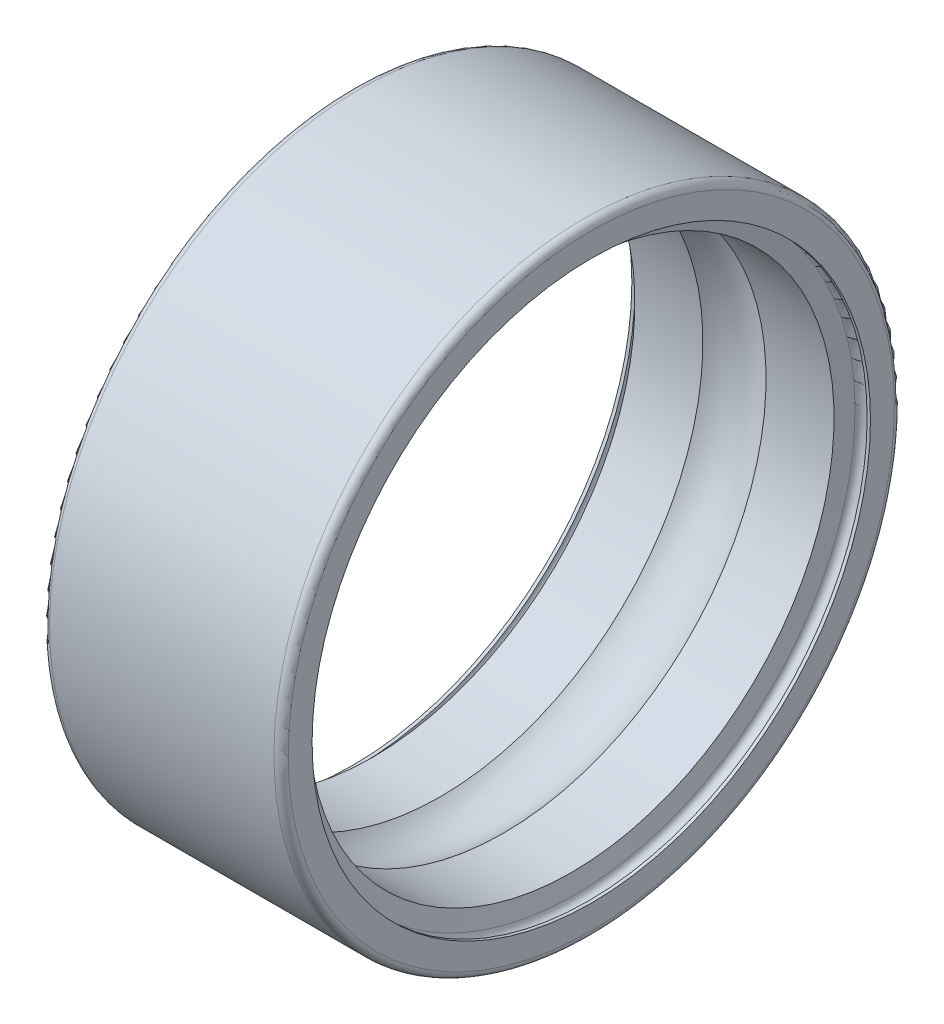
ISO-10303-21;
HEADER;
FILE_DESCRIPTION(('STEP AP214'),'2;1');
FILE_NAME('part.step','',(''),(''),'','','');
FILE_SCHEMA(('AUTOMOTIVE_DESIGN { 1 0 10303 214 1 1 1 1 }'));
ENDSEC;
DATA;
#1=APPLICATION_CONTEXT('core data for automotive mechanical design processes');
#2=APPLICATION_PROTOCOL_DEFINITION('international standard','automotive_design',2000,#1);
#3=PRODUCT_CONTEXT('',#1,'mechanical');
#4=PRODUCT('Part','Part','',(#3));
#5=PRODUCT_RELATED_PRODUCT_CATEGORY('part','',(#4));
#6=PRODUCT_DEFINITION_FORMATION('','',#4);
#7=PRODUCT_DEFINITION_CONTEXT('part definition',#1,'design');
#8=PRODUCT_DEFINITION('design','',#6,#7);
#9=PRODUCT_DEFINITION_SHAPE('','',#8);
#10=(LENGTH_UNIT() NAMED_UNIT(*) SI_UNIT(.MILLI.,.METRE.));
#11=(NAMED_UNIT(*) PLANE_ANGLE_UNIT() SI_UNIT($,.RADIAN.));
#12=(NAMED_UNIT(*) SI_UNIT($,.STERADIAN.) SOLID_ANGLE_UNIT());
#13=UNCERTAINTY_MEASURE_WITH_UNIT(LENGTH_MEASURE(1.E-05),#10,'distance_accuracy_value','');
#14=(GEOMETRIC_REPRESENTATION_CONTEXT(3) GLOBAL_UNCERTAINTY_ASSIGNED_CONTEXT((#13)) GLOBAL_UNIT_ASSIGNED_CONTEXT((#10,
#11,#12)) REPRESENTATION_CONTEXT('',''));
#15=CARTESIAN_POINT('',(0.,0.,0.));
#16=DIRECTION('',(0.,0.,1.));
#17=DIRECTION('',(1.,0.,0.));
#18=AXIS2_PLACEMENT_3D('',#15,#16,#17);
#19=CARTESIAN_POINT('',(4.79,0.,0.));
#20=DIRECTION('',(1.,0.,0.));
#21=DIRECTION('',(0.,0.,-1.));
#22=AXIS2_PLACEMENT_3D('',#19,#20,#21);
#23=TOROIDAL_SURFACE('',#22,5.85,0.14);
#24=CARTESIAN_POINT('',(4.93,0.,0.));
#25=DIRECTION('',(1.,0.,0.));
#26=DIRECTION('',(0.,1.,0.));
#27=AXIS2_PLACEMENT_3D('',#24,#25,#26);
#28=CIRCLE('',#27,5.85);
#29=CARTESIAN_POINT('',(4.93,5.85,0.));
#30=VERTEX_POINT('',#29);
#31=EDGE_CURVE('E11',#30,#30,#28,.T.);
#32=ORIENTED_EDGE('',*,*,#31,.T.);
#33=EDGE_LOOP('',(#32));
#34=FACE_BOUND('',#33,.T.);
#35=CARTESIAN_POINT('',(4.65212691457829,0.,0.));
#36=DIRECTION('',(1.,0.,0.));
#37=DIRECTION('',(0.,1.,0.));
#38=AXIS2_PLACEMENT_3D('',#35,#36,#37);
#39=CIRCLE('',#38,5.87431074487337);
#40=CARTESIAN_POINT('',(4.65212691457829,5.87431074487337,0.));
#41=VERTEX_POINT('',#40);
#42=EDGE_CURVE('E75',#41,#41,#39,.T.);
#43=ORIENTED_EDGE('',*,*,#42,.F.);
#44=EDGE_LOOP('',(#43));
#45=FACE_BOUND('',#44,.T.);
#46=ADVANCED_FACE('F16',(#34,#45),#23,.F.);
#47=CARTESIAN_POINT('',(4.965,0.,0.));
#48=DIRECTION('',(-1.,0.,0.));
#49=DIRECTION('',(0.,1.,0.));
#50=AXIS2_PLACEMENT_3D('',#47,#48,#49);
#51=CYLINDRICAL_SURFACE('',#50,5.85);
#52=CARTESIAN_POINT('',(5.,0.,0.));
#53=DIRECTION('',(1.,0.,0.));
#54=DIRECTION('',(0.,1.,0.));
#55=AXIS2_PLACEMENT_3D('',#52,#53,#54);
#56=CIRCLE('',#55,5.85);
#57=CARTESIAN_POINT('',(5.,5.85,0.));
#58=VERTEX_POINT('',#57);
#59=EDGE_CURVE('E20',#58,#58,#56,.T.);
#60=ORIENTED_EDGE('',*,*,#59,.T.);
#61=EDGE_LOOP('',(#60));
#62=FACE_BOUND('',#61,.T.);
#63=ORIENTED_EDGE('',*,*,#31,.F.);
#64=EDGE_LOOP('',(#63));
#65=FACE_BOUND('',#64,.T.);
#66=ADVANCED_FACE('F112',(#62,#65),#51,.F.);
#67=CARTESIAN_POINT('',(5.,6.1,0.));
#68=DIRECTION('',(1.,0.,0.));
#69=DIRECTION('',(0.,1.,0.));
#70=AXIS2_PLACEMENT_3D('',#67,#68,#69);
#71=PLANE('',#70);
#72=CARTESIAN_POINT('',(5.,0.,0.));
#73=DIRECTION('',(1.,0.,0.));
#74=DIRECTION('',(0.,1.,0.));
#75=AXIS2_PLACEMENT_3D('',#72,#73,#74);
#76=CIRCLE('',#75,6.35);
#77=CARTESIAN_POINT('',(5.,6.35,0.));
#78=VERTEX_POINT('',#77);
#79=EDGE_CURVE('E57',#78,#78,#76,.T.);
#80=ORIENTED_EDGE('',*,*,#79,.T.);
#81=EDGE_LOOP('',(#80));
#82=FACE_BOUND('',#81,.T.);
#83=ORIENTED_EDGE('',*,*,#59,.F.);
#84=EDGE_LOOP('',(#83));
#85=FACE_BOUND('',#84,.T.);
#86=ADVANCED_FACE('F117',(#82,#85),#71,.T.);
#87=CARTESIAN_POINT('',(4.85,0.,0.));
#88=DIRECTION('',(1.,0.,0.));
#89=DIRECTION('',(0.,0.,-1.));
#90=AXIS2_PLACEMENT_3D('',#87,#88,#89);
#91=TOROIDAL_SURFACE('',#90,6.35,0.15);
#92=CARTESIAN_POINT('',(4.85,0.,0.));
#93=DIRECTION('',(1.,0.,0.));
#94=DIRECTION('',(0.,1.,0.));
#95=AXIS2_PLACEMENT_3D('',#92,#93,#94);
#96=CIRCLE('',#95,6.5);
#97=CARTESIAN_POINT('',(4.85,6.5,0.));
#98=VERTEX_POINT('',#97);
#99=EDGE_CURVE('E54',#98,#98,#96,.T.);
#100=ORIENTED_EDGE('',*,*,#99,.T.);
#101=EDGE_LOOP('',(#100));
#102=FACE_BOUND('',#101,.T.);
#103=ORIENTED_EDGE('',*,*,#79,.F.);
#104=EDGE_LOOP('',(#103));
#105=FACE_BOUND('',#104,.T.);
#106=ADVANCED_FACE('F18',(#102,#105),#91,.T.);
#107=CARTESIAN_POINT('',(2.5,0.,0.));
#108=DIRECTION('',(-1.,0.,0.));
#109=DIRECTION('',(0.,1.,0.));
#110=AXIS2_PLACEMENT_3D('',#107,#108,#109);
#111=CYLINDRICAL_SURFACE('',#110,6.5);
#112=CARTESIAN_POINT('',(0.15,0.,0.));
#113=DIRECTION('',(1.,0.,0.));
#114=DIRECTION('',(0.,1.,0.));
#115=AXIS2_PLACEMENT_3D('',#112,#113,#114);
#116=CIRCLE('',#115,6.5);
#117=CARTESIAN_POINT('',(0.15,6.5,0.));
#118=VERTEX_POINT('',#117);
#119=EDGE_CURVE('E58',#118,#118,#116,.T.);
#120=ORIENTED_EDGE('',*,*,#119,.T.);
#121=EDGE_LOOP('',(#120));
#122=FACE_BOUND('',#121,.T.);
#123=ORIENTED_EDGE('',*,*,#99,.F.);
#124=EDGE_LOOP('',(#123));
#125=FACE_BOUND('',#124,.T.);
#126=ADVANCED_FACE('F127',(#122,#125),#111,.T.);
#127=CARTESIAN_POINT('',(0.15,0.,0.));
#128=DIRECTION('',(1.,0.,0.));
#129=DIRECTION('',(0.,0.,-1.));
#130=AXIS2_PLACEMENT_3D('',#127,#128,#129);
#131=TOROIDAL_SURFACE('',#130,6.35,0.15);
#132=CARTESIAN_POINT('',(0.,0.,0.));
#133=DIRECTION('',(1.,0.,0.));
#134=DIRECTION('',(0.,1.,0.));
#135=AXIS2_PLACEMENT_3D('',#132,#133,#134);
#136=CIRCLE('',#135,6.35);
#137=CARTESIAN_POINT('',(0.,6.35,0.));
#138=VERTEX_POINT('',#137);
#139=EDGE_CURVE('E61',#138,#138,#136,.T.);
#140=ORIENTED_EDGE('',*,*,#139,.T.);
#141=EDGE_LOOP('',(#140));
#142=FACE_BOUND('',#141,.T.);
#143=ORIENTED_EDGE('',*,*,#119,.F.);
#144=EDGE_LOOP('',(#143));
#145=FACE_BOUND('',#144,.T.);
#146=ADVANCED_FACE('F125',(#142,#145),#131,.T.);
#147=CARTESIAN_POINT('',(0.,6.1,0.));
#148=DIRECTION('',(-1.,0.,0.));
#149=DIRECTION('',(0.,-1.,0.));
#150=AXIS2_PLACEMENT_3D('',#147,#148,#149);
#151=PLANE('',#150);
#152=CARTESIAN_POINT('',(0.,0.,0.));
#153=DIRECTION('',(1.,0.,0.));
#154=DIRECTION('',(0.,1.,0.));
#155=AXIS2_PLACEMENT_3D('',#152,#153,#154);
#156=CIRCLE('',#155,5.85);
#157=CARTESIAN_POINT('',(0.,5.85,0.));
#158=VERTEX_POINT('',#157);
#159=EDGE_CURVE('E71',#158,#158,#156,.T.);
#160=ORIENTED_EDGE('',*,*,#159,.T.);
#161=EDGE_LOOP('',(#160));
#162=FACE_BOUND('',#161,.T.);
#163=ORIENTED_EDGE('',*,*,#139,.F.);
#164=EDGE_LOOP('',(#163));
#165=FACE_BOUND('',#164,.T.);
#166=ADVANCED_FACE('F122',(#162,#165),#151,.T.);
#167=CARTESIAN_POINT('',(0.035,0.,0.));
#168=DIRECTION('',(-1.,0.,0.));
#169=DIRECTION('',(0.,1.,0.));
#170=AXIS2_PLACEMENT_3D('',#167,#168,#169);
#171=CYLINDRICAL_SURFACE('',#170,5.85);
#172=CARTESIAN_POINT('',(0.07,0.,0.));
#173=DIRECTION('',(1.,0.,0.));
#174=DIRECTION('',(0.,1.,0.));
#175=AXIS2_PLACEMENT_3D('',#172,#173,#174);
#176=CIRCLE('',#175,5.85);
#177=CARTESIAN_POINT('',(0.07,5.85,0.));
#178=VERTEX_POINT('',#177);
#179=EDGE_CURVE('E72',#178,#178,#176,.T.);
#180=ORIENTED_EDGE('',*,*,#179,.T.);
#181=EDGE_LOOP('',(#180));
#182=FACE_BOUND('',#181,.T.);
#183=ORIENTED_EDGE('',*,*,#159,.F.);
#184=EDGE_LOOP('',(#183));
#185=FACE_BOUND('',#184,.T.);
#186=ADVANCED_FACE('F108',(#182,#185),#171,.F.);
#187=CARTESIAN_POINT('',(0.21,0.,0.));
#188=DIRECTION('',(1.,0.,0.));
#189=DIRECTION('',(0.,0.,-1.));
#190=AXIS2_PLACEMENT_3D('',#187,#188,#189);
#191=TOROIDAL_SURFACE('',#190,5.85,0.14);
#192=CARTESIAN_POINT('',(0.347873085421709,0.,0.));
#193=DIRECTION('',(1.,0.,0.));
#194=DIRECTION('',(0.,1.,0.));
#195=AXIS2_PLACEMENT_3D('',#192,#193,#194);
#196=CIRCLE('',#195,5.87431074487337);
#197=CARTESIAN_POINT('',(0.347873085421709,5.87431074487337,0.));
#198=VERTEX_POINT('',#197);
#199=EDGE_CURVE('E66',#198,#198,#196,.T.);
#200=ORIENTED_EDGE('',*,*,#199,.T.);
#201=EDGE_LOOP('',(#200));
#202=FACE_BOUND('',#201,.T.);
#203=ORIENTED_EDGE('',*,*,#179,.F.);
#204=EDGE_LOOP('',(#203));
#205=FACE_BOUND('',#204,.T.);
#206=ADVANCED_FACE('F93',(#202,#205),#191,.F.);
#207=CARTESIAN_POINT('',(0.380873627166838,0.,0.));
#208=DIRECTION('',(-1.,0.,0.));
#209=DIRECTION('',(0.,1.,0.));
#210=AXIS2_PLACEMENT_3D('',#207,#208,#209);
#211=CONICAL_SURFACE('',#210,5.68715537243669,1.39626340159546);
#212=CARTESIAN_POINT('',(0.413874168911967,0.,0.));
#213=DIRECTION('',(1.,0.,0.));
#214=DIRECTION('',(0.,1.,0.));
#215=AXIS2_PLACEMENT_3D('',#212,#213,#214);
#216=CIRCLE('',#215,5.5);
#217=CARTESIAN_POINT('',(0.413874168911966,5.5,0.));
#218=VERTEX_POINT('',#217);
#219=EDGE_CURVE('E65',#218,#218,#216,.T.);
#220=ORIENTED_EDGE('',*,*,#219,.T.);
#221=EDGE_LOOP('',(#220));
#222=FACE_BOUND('',#221,.T.);
#223=ORIENTED_EDGE('',*,*,#199,.F.);
#224=EDGE_LOOP('',(#223));
#225=FACE_BOUND('',#224,.T.);
#226=ADVANCED_FACE('F96',(#222,#225),#211,.F.);
#227=CARTESIAN_POINT('',(1.12621817057291,0.,0.));
#228=DIRECTION('',(-1.,0.,0.));
#229=DIRECTION('',(0.,1.,0.));
#230=AXIS2_PLACEMENT_3D('',#227,#228,#229);
#231=CYLINDRICAL_SURFACE('',#230,5.5);
#232=CARTESIAN_POINT('',(1.83856217223385,0.,0.));
#233=DIRECTION('',(1.,0.,0.));
#234=DIRECTION('',(0.,1.,0.));
#235=AXIS2_PLACEMENT_3D('',#232,#233,#234);
#236=CIRCLE('',#235,5.5);
#237=CARTESIAN_POINT('',(1.83856217223385,5.5,0.));
#238=VERTEX_POINT('',#237);
#239=EDGE_CURVE('E67',#238,#238,#236,.T.);
#240=ORIENTED_EDGE('',*,*,#239,.T.);
#241=EDGE_LOOP('',(#240));
#242=FACE_BOUND('',#241,.T.);
#243=ORIENTED_EDGE('',*,*,#219,.F.);
#244=EDGE_LOOP('',(#243));
#245=FACE_BOUND('',#244,.T.);
#246=ADVANCED_FACE('F98',(#242,#245),#231,.F.);
#247=CARTESIAN_POINT('',(2.5,0.,0.));
#248=DIRECTION('',(1.,0.,0.));
#249=DIRECTION('',(0.,0.,-1.));
#250=AXIS2_PLACEMENT_3D('',#247,#248,#249);
#251=TOROIDAL_SURFACE('',#250,4.75,1.);
#252=CARTESIAN_POINT('',(3.16143782776615,0.,0.));
#253=DIRECTION('',(1.,0.,0.));
#254=DIRECTION('',(0.,1.,0.));
#255=AXIS2_PLACEMENT_3D('',#252,#253,#254);
#256=CIRCLE('',#255,5.5);
#257=CARTESIAN_POINT('',(3.16143782776615,5.5,0.));
#258=VERTEX_POINT('',#257);
#259=EDGE_CURVE('E78',#258,#258,#256,.T.);
#260=ORIENTED_EDGE('',*,*,#259,.T.);
#261=EDGE_LOOP('',(#260));
#262=FACE_BOUND('',#261,.T.);
#263=ORIENTED_EDGE('',*,*,#239,.F.);
#264=EDGE_LOOP('',(#263));
#265=FACE_BOUND('',#264,.T.);
#266=ADVANCED_FACE('F106',(#262,#265),#251,.F.);
#267=CARTESIAN_POINT('',(3.87378182942709,0.,0.));
#268=DIRECTION('',(-1.,0.,0.));
#269=DIRECTION('',(0.,1.,0.));
#270=AXIS2_PLACEMENT_3D('',#267,#268,#269);
#271=CYLINDRICAL_SURFACE('',#270,5.5);
#272=CARTESIAN_POINT('',(4.58612583108803,0.,0.));
#273=DIRECTION('',(1.,0.,0.));
#274=DIRECTION('',(0.,1.,0.));
#275=AXIS2_PLACEMENT_3D('',#272,#273,#274);
#276=CIRCLE('',#275,5.5);
#277=CARTESIAN_POINT('',(4.58612583108803,5.5,0.));
#278=VERTEX_POINT('',#277);
#279=EDGE_CURVE('E79',#278,#278,#276,.T.);
#280=ORIENTED_EDGE('',*,*,#279,.T.);
#281=EDGE_LOOP('',(#280));
#282=FACE_BOUND('',#281,.T.);
#283=ORIENTED_EDGE('',*,*,#259,.F.);
#284=EDGE_LOOP('',(#283));
#285=FACE_BOUND('',#284,.T.);
#286=ADVANCED_FACE('F180',(#282,#285),#271,.F.);
#287=CARTESIAN_POINT('',(4.61912637283316,0.,0.));
#288=DIRECTION('',(1.,0.,0.));
#289=DIRECTION('',(0.,1.,0.));
#290=AXIS2_PLACEMENT_3D('',#287,#288,#289);
#291=CONICAL_SURFACE('',#290,5.68715537243669,1.39626340159546);
#292=ORIENTED_EDGE('',*,*,#42,.T.);
#293=EDGE_LOOP('',(#292));
#294=FACE_BOUND('',#293,.T.);
#295=ORIENTED_EDGE('',*,*,#279,.F.);
#296=EDGE_LOOP('',(#295));
#297=FACE_BOUND('',#296,.T.);
#298=ADVANCED_FACE('F189',(#294,#297),#291,.F.);
#299=CLOSED_SHELL('',(#46,#66,#86,#106,#126,#146,#166,#186,#206,#226,#246,#266,#286,#298));
#300=MANIFOLD_SOLID_BREP('B1',#299);
#301=ADVANCED_BREP_SHAPE_REPRESENTATION('',(#18,#300),#14);
#302=SHAPE_DEFINITION_REPRESENTATION(#9,#301);
ENDSEC;
END-ISO-10303-21;
